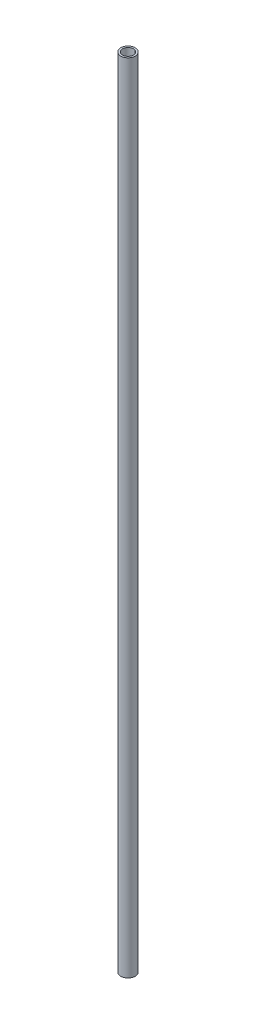
ISO-10303-21;
HEADER;
FILE_DESCRIPTION(('STEP AP214'),'2;1');
FILE_NAME('part.step','',(''),(''),'','','');
FILE_SCHEMA(('AUTOMOTIVE_DESIGN { 1 0 10303 214 1 1 1 1 }'));
ENDSEC;
DATA;
#1=APPLICATION_CONTEXT('core data for automotive mechanical design processes');
#2=APPLICATION_PROTOCOL_DEFINITION('international standard','automotive_design',2000,#1);
#3=PRODUCT_CONTEXT('',#1,'mechanical');
#4=PRODUCT('Part','Part','',(#3));
#5=PRODUCT_RELATED_PRODUCT_CATEGORY('part','',(#4));
#6=PRODUCT_DEFINITION_FORMATION('','',#4);
#7=PRODUCT_DEFINITION_CONTEXT('part definition',#1,'design');
#8=PRODUCT_DEFINITION('design','',#6,#7);
#9=PRODUCT_DEFINITION_SHAPE('','',#8);
#10=(LENGTH_UNIT() NAMED_UNIT(*) SI_UNIT(.MILLI.,.METRE.));
#11=(NAMED_UNIT(*) PLANE_ANGLE_UNIT() SI_UNIT($,.RADIAN.));
#12=(NAMED_UNIT(*) SI_UNIT($,.STERADIAN.) SOLID_ANGLE_UNIT());
#13=UNCERTAINTY_MEASURE_WITH_UNIT(LENGTH_MEASURE(1.E-05),#10,'distance_accuracy_value','');
#14=(GEOMETRIC_REPRESENTATION_CONTEXT(3) GLOBAL_UNCERTAINTY_ASSIGNED_CONTEXT((#13)) GLOBAL_UNIT_ASSIGNED_CONTEXT((#10,
#11,#12)) REPRESENTATION_CONTEXT('',''));
#15=CARTESIAN_POINT('',(0.,0.,0.));
#16=DIRECTION('',(0.,0.,1.));
#17=DIRECTION('',(1.,0.,0.));
#18=AXIS2_PLACEMENT_3D('',#15,#16,#17);
#19=CARTESIAN_POINT('',(0.,275.,0.));
#20=DIRECTION('',(0.,1.,0.));
#21=DIRECTION('',(0.,0.,1.));
#22=AXIS2_PLACEMENT_3D('',#19,#20,#21);
#23=PLANE('',#22);
#24=CARTESIAN_POINT('',(0.,275.,0.));
#25=DIRECTION('',(0.,1.,0.));
#26=DIRECTION('',(0.,0.,1.));
#27=AXIS2_PLACEMENT_3D('',#24,#25,#26);
#28=CIRCLE('',#27,5.);
#29=CARTESIAN_POINT('',(0.,275.,5.));
#30=VERTEX_POINT('',#29);
#31=EDGE_CURVE('E10',#30,#30,#28,.T.);
#32=ORIENTED_EDGE('',*,*,#31,.T.);
#33=EDGE_LOOP('',(#32));
#34=FACE_BOUND('',#33,.T.);
#35=CARTESIAN_POINT('',(0.,275.,0.));
#36=DIRECTION('',(0.,1.,0.));
#37=DIRECTION('',(0.,0.,1.));
#38=AXIS2_PLACEMENT_3D('',#35,#36,#37);
#39=CIRCLE('',#38,3.75);
#40=CARTESIAN_POINT('',(0.,275.,3.75));
#41=VERTEX_POINT('',#40);
#42=EDGE_CURVE('E50',#41,#41,#39,.T.);
#43=ORIENTED_EDGE('',*,*,#42,.F.);
#44=EDGE_LOOP('',(#43));
#45=FACE_BOUND('',#44,.T.);
#46=ADVANCED_FACE('F39',(#34,#45),#23,.T.);
#47=CARTESIAN_POINT('',(0.,-275.,0.));
#48=DIRECTION('',(0.,1.,0.));
#49=DIRECTION('',(0.,0.,1.));
#50=AXIS2_PLACEMENT_3D('',#47,#48,#49);
#51=PLANE('',#50);
#52=CARTESIAN_POINT('',(0.,-275.,0.));
#53=DIRECTION('',(0.,1.,0.));
#54=DIRECTION('',(0.,0.,1.));
#55=AXIS2_PLACEMENT_3D('',#52,#53,#54);
#56=CIRCLE('',#55,5.);
#57=CARTESIAN_POINT('',(0.,-275.,5.));
#58=VERTEX_POINT('',#57);
#59=EDGE_CURVE('E43',#58,#58,#56,.T.);
#60=ORIENTED_EDGE('',*,*,#59,.F.);
#61=EDGE_LOOP('',(#60));
#62=FACE_BOUND('',#61,.T.);
#63=CARTESIAN_POINT('',(0.,-275.,0.));
#64=DIRECTION('',(0.,1.,0.));
#65=DIRECTION('',(0.,0.,1.));
#66=AXIS2_PLACEMENT_3D('',#63,#64,#65);
#67=CIRCLE('',#66,3.75);
#68=CARTESIAN_POINT('',(0.,-275.,3.75));
#69=VERTEX_POINT('',#68);
#70=EDGE_CURVE('E52',#69,#69,#67,.T.);
#71=ORIENTED_EDGE('',*,*,#70,.T.);
#72=EDGE_LOOP('',(#71));
#73=FACE_BOUND('',#72,.T.);
#74=ADVANCED_FACE('F62',(#62,#73),#51,.F.);
#75=CARTESIAN_POINT('',(0.,275.,0.));
#76=DIRECTION('',(0.,-1.,0.));
#77=DIRECTION('',(0.,0.,-1.));
#78=AXIS2_PLACEMENT_3D('',#75,#76,#77);
#79=CYLINDRICAL_SURFACE('',#78,5.);
#80=ORIENTED_EDGE('',*,*,#31,.F.);
#81=EDGE_LOOP('',(#80));
#82=FACE_BOUND('',#81,.T.);
#83=ORIENTED_EDGE('',*,*,#59,.T.);
#84=EDGE_LOOP('',(#83));
#85=FACE_BOUND('',#84,.T.);
#86=ADVANCED_FACE('F41',(#82,#85),#79,.T.);
#87=CARTESIAN_POINT('',(0.,275.,0.));
#88=DIRECTION('',(0.,-1.,0.));
#89=DIRECTION('',(0.,0.,-1.));
#90=AXIS2_PLACEMENT_3D('',#87,#88,#89);
#91=CYLINDRICAL_SURFACE('',#90,3.75);
#92=ORIENTED_EDGE('',*,*,#42,.T.);
#93=EDGE_LOOP('',(#92));
#94=FACE_BOUND('',#93,.T.);
#95=ORIENTED_EDGE('',*,*,#70,.F.);
#96=EDGE_LOOP('',(#95));
#97=FACE_BOUND('',#96,.T.);
#98=ADVANCED_FACE('F58',(#94,#97),#91,.F.);
#99=CLOSED_SHELL('',(#46,#74,#86,#98));
#100=MANIFOLD_SOLID_BREP('B2',#99);
#101=ADVANCED_BREP_SHAPE_REPRESENTATION('',(#18,#100),#14);
#102=SHAPE_DEFINITION_REPRESENTATION(#9,#101);
ENDSEC;
END-ISO-10303-21;
